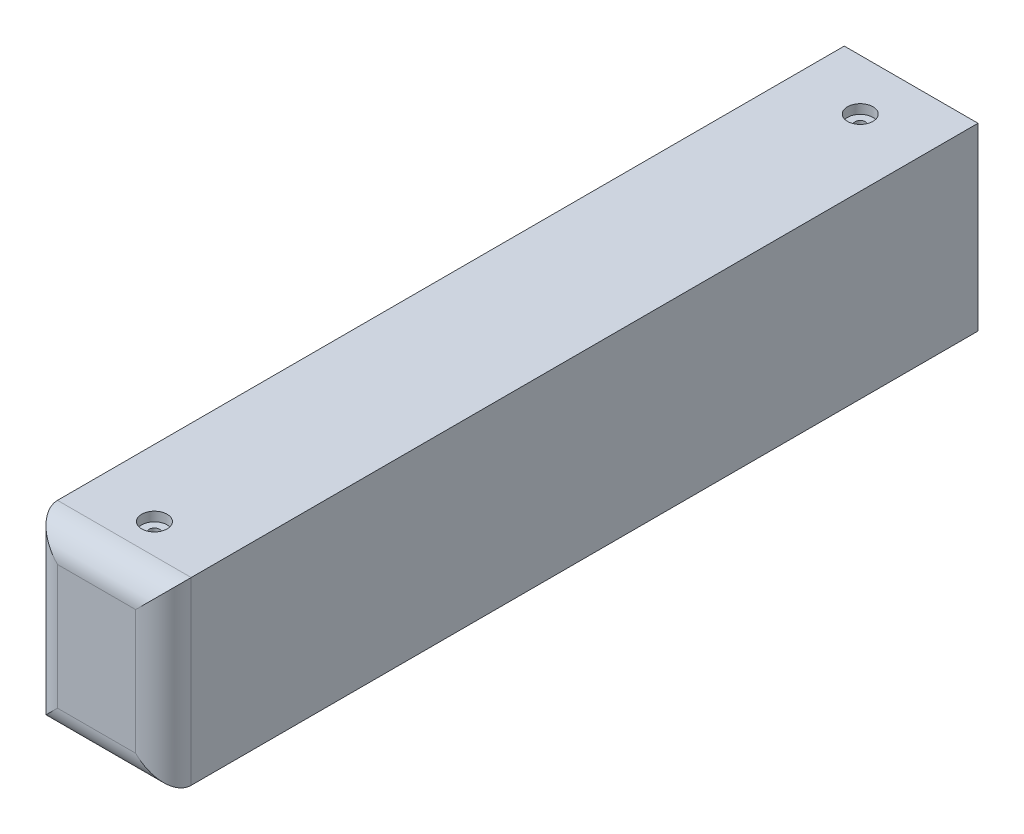
ISO-10303-21;
HEADER;
FILE_DESCRIPTION(('STEP AP214'),'2;1');
FILE_NAME('part.step','',(''),(''),'','','');
FILE_SCHEMA(('AUTOMOTIVE_DESIGN { 1 0 10303 214 1 1 1 1 }'));
ENDSEC;
DATA;
#1=APPLICATION_CONTEXT('core data for automotive mechanical design processes');
#2=APPLICATION_PROTOCOL_DEFINITION('international standard','automotive_design',2000,#1);
#3=PRODUCT_CONTEXT('',#1,'mechanical');
#4=PRODUCT('Part','Part','',(#3));
#5=PRODUCT_RELATED_PRODUCT_CATEGORY('part','',(#4));
#6=PRODUCT_DEFINITION_FORMATION('','',#4);
#7=PRODUCT_DEFINITION_CONTEXT('part definition',#1,'design');
#8=PRODUCT_DEFINITION('design','',#6,#7);
#9=PRODUCT_DEFINITION_SHAPE('','',#8);
#10=(LENGTH_UNIT() NAMED_UNIT(*) SI_UNIT(.MILLI.,.METRE.));
#11=(NAMED_UNIT(*) PLANE_ANGLE_UNIT() SI_UNIT($,.RADIAN.));
#12=(NAMED_UNIT(*) SI_UNIT($,.STERADIAN.) SOLID_ANGLE_UNIT());
#13=UNCERTAINTY_MEASURE_WITH_UNIT(LENGTH_MEASURE(1.E-05),#10,'distance_accuracy_value','');
#14=(GEOMETRIC_REPRESENTATION_CONTEXT(3) GLOBAL_UNCERTAINTY_ASSIGNED_CONTEXT((#13)) GLOBAL_UNIT_ASSIGNED_CONTEXT((#10,
#11,#12)) REPRESENTATION_CONTEXT('',''));
#15=CARTESIAN_POINT('',(0.,0.,0.));
#16=DIRECTION('',(0.,0.,1.));
#17=DIRECTION('',(1.,0.,0.));
#18=AXIS2_PLACEMENT_3D('',#15,#16,#17);
#19=CARTESIAN_POINT('',(57.7777777777778,-77.7777777777778,704.));
#20=DIRECTION('',(0.,1.,0.));
#21=DIRECTION('',(-1.,0.,0.));
#22=AXIS2_PLACEMENT_3D('',#19,#20,#21);
#23=PLANE('',#22);
#24=CARTESIAN_POINT('',(0.,-77.7777777777778,654.));
#25=DIRECTION('',(0.,-1.,0.));
#26=DIRECTION('',(0.,0.,-1.));
#27=AXIS2_PLACEMENT_3D('',#24,#25,#26);
#28=CIRCLE('',#27,7.5);
#29=CARTESIAN_POINT('',(0.,-77.7777777777778,646.5));
#30=VERTEX_POINT('',#29);
#31=EDGE_CURVE('E351',#30,#30,#28,.T.);
#32=ORIENTED_EDGE('',*,*,#31,.F.);
#33=EDGE_LOOP('',(#32));
#34=FACE_BOUND('',#33,.T.);
#35=CARTESIAN_POINT('',(0.,-77.7777777777778,43.9999999999999));
#36=DIRECTION('',(0.,-1.,0.));
#37=DIRECTION('',(0.,0.,-1.));
#38=AXIS2_PLACEMENT_3D('',#35,#36,#37);
#39=CIRCLE('',#38,7.5);
#40=CARTESIAN_POINT('',(0.,-77.7777777777778,36.4999999999999));
#41=VERTEX_POINT('',#40);
#42=EDGE_CURVE('E358',#41,#41,#39,.T.);
#43=ORIENTED_EDGE('',*,*,#42,.F.);
#44=EDGE_LOOP('',(#43));
#45=FACE_BOUND('',#44,.T.);
#46=DIRECTION('',(1.,0.,0.));
#47=VECTOR('',#46,1.);
#48=CARTESIAN_POINT('',(-57.7777777777778,-77.7777777777778,680.));
#49=LINE('',#48,#47);
#50=CARTESIAN_POINT('',(-57.7777777777778,-77.7777777777778,680.));
#51=VERTEX_POINT('',#50);
#52=CARTESIAN_POINT('',(57.7777777777778,-77.7777777777778,680.));
#53=VERTEX_POINT('',#52);
#54=EDGE_CURVE('E98',#51,#53,#49,.T.);
#55=ORIENTED_EDGE('',*,*,#54,.F.);
#56=DIRECTION('',(0.,0.,-1.));
#57=VECTOR('',#56,1.);
#58=CARTESIAN_POINT('',(-57.7777777777778,-77.7777777777778,704.));
#59=LINE('',#58,#57);
#60=CARTESIAN_POINT('',(-57.7777777777778,-77.7777777777778,0.));
#61=VERTEX_POINT('',#60);
#62=EDGE_CURVE('E107',#51,#61,#59,.T.);
#63=ORIENTED_EDGE('',*,*,#62,.T.);
#64=DIRECTION('',(1.,0.,0.));
#65=VECTOR('',#64,1.);
#66=CARTESIAN_POINT('',(57.7777777777778,-77.7777777777778,0.));
#67=LINE('',#66,#65);
#68=CARTESIAN_POINT('',(57.7777777777778,-77.7777777777778,0.));
#69=VERTEX_POINT('',#68);
#70=EDGE_CURVE('E105',#61,#69,#67,.T.);
#71=ORIENTED_EDGE('',*,*,#70,.T.);
#72=DIRECTION('',(0.,0.,-1.));
#73=VECTOR('',#72,1.);
#74=CARTESIAN_POINT('',(57.7777777777778,-77.7777777777778,704.));
#75=LINE('',#74,#73);
#76=EDGE_CURVE('E92',#53,#69,#75,.T.);
#77=ORIENTED_EDGE('',*,*,#76,.F.);
#78=EDGE_LOOP('',(#55,#63,#71,#77));
#79=FACE_BOUND('',#78,.T.);
#80=ADVANCED_FACE('F33',(#34,#45,#79),#23,.F.);
#81=CARTESIAN_POINT('',(0.,0.,704.));
#82=DIRECTION('',(0.,0.,1.));
#83=DIRECTION('',(1.,0.,0.));
#84=AXIS2_PLACEMENT_3D('',#81,#82,#83);
#85=PLANE('',#84);
#86=DIRECTION('',(0.,1.,0.));
#87=VECTOR('',#86,1.);
#88=CARTESIAN_POINT('',(33.7777777777778,-77.7777777777778,704.));
#89=LINE('',#88,#87);
#90=CARTESIAN_POINT('',(33.7777777777778,-53.7777777777778,704.));
#91=VERTEX_POINT('',#90);
#92=CARTESIAN_POINT('',(33.7777777777778,53.7777777777778,704.));
#93=VERTEX_POINT('',#92);
#94=EDGE_CURVE('E47',#91,#93,#89,.T.);
#95=ORIENTED_EDGE('',*,*,#94,.T.);
#96=DIRECTION('',(1.,0.,0.));
#97=VECTOR('',#96,1.);
#98=CARTESIAN_POINT('',(-57.7777777777778,53.7777777777778,704.));
#99=LINE('',#98,#97);
#100=CARTESIAN_POINT('',(-33.7777777777778,53.7777777777778,704.));
#101=VERTEX_POINT('',#100);
#102=EDGE_CURVE('E126',#101,#93,#99,.T.);
#103=ORIENTED_EDGE('',*,*,#102,.F.);
#104=DIRECTION('',(0.,1.,0.));
#105=VECTOR('',#104,1.);
#106=CARTESIAN_POINT('',(-33.7777777777778,-77.7777777777778,704.));
#107=LINE('',#106,#105);
#108=CARTESIAN_POINT('',(-33.7777777777778,-53.7777777777778,704.));
#109=VERTEX_POINT('',#108);
#110=EDGE_CURVE('E102',#109,#101,#107,.T.);
#111=ORIENTED_EDGE('',*,*,#110,.F.);
#112=DIRECTION('',(1.,0.,0.));
#113=VECTOR('',#112,1.);
#114=CARTESIAN_POINT('',(-57.7777777777778,-53.7777777777778,704.));
#115=LINE('',#114,#113);
#116=EDGE_CURVE('E54',#109,#91,#115,.T.);
#117=ORIENTED_EDGE('',*,*,#116,.T.);
#118=EDGE_LOOP('',(#95,#103,#111,#117));
#119=FACE_BOUND('',#118,.T.);
#120=ADVANCED_FACE('F124',(#119),#85,.T.);
#121=CARTESIAN_POINT('',(57.7777777777778,-77.7777777777778,704.));
#122=DIRECTION('',(-1.,0.,0.));
#123=DIRECTION('',(0.,0.,1.));
#124=AXIS2_PLACEMENT_3D('',#121,#122,#123);
#125=PLANE('',#124);
#126=DIRECTION('',(0.,0.,-1.));
#127=VECTOR('',#126,1.);
#128=CARTESIAN_POINT('',(57.7777777777778,77.7777777777778,704.));
#129=LINE('',#128,#127);
#130=CARTESIAN_POINT('',(57.7777777777778,77.7777777777778,680.));
#131=VERTEX_POINT('',#130);
#132=CARTESIAN_POINT('',(57.7777777777778,77.7777777777778,0.));
#133=VERTEX_POINT('',#132);
#134=EDGE_CURVE('E94',#131,#133,#129,.T.);
#135=ORIENTED_EDGE('',*,*,#134,.F.);
#136=DIRECTION('',(0.,1.,0.));
#137=VECTOR('',#136,1.);
#138=CARTESIAN_POINT('',(57.7777777777778,-77.7777777777778,680.));
#139=LINE('',#138,#137);
#140=EDGE_CURVE('E84',#53,#131,#139,.T.);
#141=ORIENTED_EDGE('',*,*,#140,.F.);
#142=ORIENTED_EDGE('',*,*,#76,.T.);
#143=DIRECTION('',(0.,1.,0.));
#144=VECTOR('',#143,1.);
#145=CARTESIAN_POINT('',(57.7777777777778,-77.7777777777778,0.));
#146=LINE('',#145,#144);
#147=EDGE_CURVE('E139',#69,#133,#146,.T.);
#148=ORIENTED_EDGE('',*,*,#147,.T.);
#149=EDGE_LOOP('',(#135,#141,#142,#148));
#150=FACE_BOUND('',#149,.T.);
#151=ADVANCED_FACE('F89',(#150),#125,.F.);
#152=CARTESIAN_POINT('',(-33.7777777777778,-77.7777777777778,680.));
#153=DIRECTION('',(0.,1.,0.));
#154=DIRECTION('',(0.,0.,1.));
#155=AXIS2_PLACEMENT_3D('',#152,#153,#154);
#156=CYLINDRICAL_SURFACE('',#155,24.);
#157=DIRECTION('',(0.,1.,0.));
#158=VECTOR('',#157,1.);
#159=CARTESIAN_POINT('',(-57.7777777777778,-77.7777777777778,680.));
#160=LINE('',#159,#158);
#161=CARTESIAN_POINT('',(-57.7777777777778,77.7777777777778,680.));
#162=VERTEX_POINT('',#161);
#163=EDGE_CURVE('E120',#51,#162,#160,.T.);
#164=ORIENTED_EDGE('',*,*,#163,.F.);
#165=CARTESIAN_POINT('',(-33.7777777777778,-53.7777777777778,680.));
#166=DIRECTION('',(-0.707106781186547,0.707106781186548,0.));
#167=DIRECTION('',(0.707106781186547,0.707106781186548,0.));
#168=AXIS2_PLACEMENT_3D('',#165,#166,#167);
#169=ELLIPSE('',#168,33.9411254969543,24.);
#170=EDGE_CURVE('E41',#51,#109,#169,.T.);
#171=ORIENTED_EDGE('',*,*,#170,.T.);
#172=ORIENTED_EDGE('',*,*,#110,.T.);
#173=CARTESIAN_POINT('',(-33.7777777777778,53.7777777777778,680.));
#174=DIRECTION('',(0.707106781186547,0.707106781186547,0.));
#175=DIRECTION('',(0.707106781186547,-0.707106781186547,0.));
#176=AXIS2_PLACEMENT_3D('',#173,#174,#175);
#177=ELLIPSE('',#176,33.9411254969543,24.);
#178=EDGE_CURVE('E109',#101,#162,#177,.F.);
#179=ORIENTED_EDGE('',*,*,#178,.T.);
#180=EDGE_LOOP('',(#164,#171,#172,#179));
#181=FACE_BOUND('',#180,.T.);
#182=ADVANCED_FACE('F117',(#181),#156,.T.);
#183=CARTESIAN_POINT('',(-57.7777777777778,53.7777777777778,680.));
#184=DIRECTION('',(1.,0.,0.));
#185=DIRECTION('',(0.,0.,-1.));
#186=AXIS2_PLACEMENT_3D('',#183,#184,#185);
#187=CYLINDRICAL_SURFACE('',#186,24.);
#188=ORIENTED_EDGE('',*,*,#102,.T.);
#189=CARTESIAN_POINT('',(33.7777777777778,53.7777777777778,680.));
#190=DIRECTION('',(0.707106781186547,-0.707106781186547,0.));
#191=DIRECTION('',(0.707106781186547,0.707106781186547,0.));
#192=AXIS2_PLACEMENT_3D('',#189,#190,#191);
#193=ELLIPSE('',#192,33.9411254969543,24.);
#194=EDGE_CURVE('E198',#93,#131,#193,.F.);
#195=ORIENTED_EDGE('',*,*,#194,.T.);
#196=DIRECTION('',(1.,0.,0.));
#197=VECTOR('',#196,1.);
#198=CARTESIAN_POINT('',(-57.7777777777778,77.7777777777778,680.));
#199=LINE('',#198,#197);
#200=EDGE_CURVE('E128',#162,#131,#199,.T.);
#201=ORIENTED_EDGE('',*,*,#200,.F.);
#202=ORIENTED_EDGE('',*,*,#178,.F.);
#203=EDGE_LOOP('',(#188,#195,#201,#202));
#204=FACE_BOUND('',#203,.T.);
#205=ADVANCED_FACE('F171',(#204),#187,.T.);
#206=CARTESIAN_POINT('',(57.7777777777778,77.7777777777778,704.));
#207=DIRECTION('',(0.,-1.,0.));
#208=DIRECTION('',(0.,0.,-1.));
#209=AXIS2_PLACEMENT_3D('',#206,#207,#208);
#210=PLANE('',#209);
#211=CARTESIAN_POINT('',(0.,77.7777777777778,654.));
#212=DIRECTION('',(0.,1.,0.));
#213=DIRECTION('',(0.,0.,1.));
#214=AXIS2_PLACEMENT_3D('',#211,#212,#213);
#215=CIRCLE('',#214,11.);
#216=CARTESIAN_POINT('',(0.,77.7777777777778,665.));
#217=VERTEX_POINT('',#216);
#218=EDGE_CURVE('E181',#217,#217,#215,.T.);
#219=ORIENTED_EDGE('',*,*,#218,.F.);
#220=EDGE_LOOP('',(#219));
#221=FACE_BOUND('',#220,.T.);
#222=CARTESIAN_POINT('',(0.,77.7777777777778,43.9999999999999));
#223=DIRECTION('',(0.,1.,0.));
#224=DIRECTION('',(0.,0.,1.));
#225=AXIS2_PLACEMENT_3D('',#222,#223,#224);
#226=CIRCLE('',#225,11.);
#227=CARTESIAN_POINT('',(0.,77.7777777777778,54.9999999999999));
#228=VERTEX_POINT('',#227);
#229=EDGE_CURVE('E184',#228,#228,#226,.T.);
#230=ORIENTED_EDGE('',*,*,#229,.F.);
#231=EDGE_LOOP('',(#230));
#232=FACE_BOUND('',#231,.T.);
#233=ORIENTED_EDGE('',*,*,#200,.T.);
#234=ORIENTED_EDGE('',*,*,#134,.T.);
#235=DIRECTION('',(-1.,0.,0.));
#236=VECTOR('',#235,1.);
#237=CARTESIAN_POINT('',(57.7777777777778,77.7777777777778,0.));
#238=LINE('',#237,#236);
#239=CARTESIAN_POINT('',(-57.7777777777778,77.7777777777778,0.));
#240=VERTEX_POINT('',#239);
#241=EDGE_CURVE('E141',#133,#240,#238,.T.);
#242=ORIENTED_EDGE('',*,*,#241,.T.);
#243=DIRECTION('',(0.,0.,-1.));
#244=VECTOR('',#243,1.);
#245=CARTESIAN_POINT('',(-57.7777777777778,77.7777777777778,704.));
#246=LINE('',#245,#244);
#247=EDGE_CURVE('E111',#162,#240,#246,.T.);
#248=ORIENTED_EDGE('',*,*,#247,.F.);
#249=EDGE_LOOP('',(#233,#234,#242,#248));
#250=FACE_BOUND('',#249,.T.);
#251=ADVANCED_FACE('F149',(#221,#232,#250),#210,.F.);
#252=CARTESIAN_POINT('',(-57.7777777777778,-77.7777777777778,704.));
#253=DIRECTION('',(1.,0.,0.));
#254=DIRECTION('',(0.,0.,-1.));
#255=AXIS2_PLACEMENT_3D('',#252,#253,#254);
#256=PLANE('',#255);
#257=ORIENTED_EDGE('',*,*,#62,.F.);
#258=ORIENTED_EDGE('',*,*,#163,.T.);
#259=ORIENTED_EDGE('',*,*,#247,.T.);
#260=DIRECTION('',(0.,-1.,0.));
#261=VECTOR('',#260,1.);
#262=CARTESIAN_POINT('',(-57.7777777777778,-77.7777777777778,0.));
#263=LINE('',#262,#261);
#264=EDGE_CURVE('E133',#240,#61,#263,.T.);
#265=ORIENTED_EDGE('',*,*,#264,.T.);
#266=EDGE_LOOP('',(#257,#258,#259,#265));
#267=FACE_BOUND('',#266,.T.);
#268=ADVANCED_FACE('F35',(#267),#256,.F.);
#269=CARTESIAN_POINT('',(0.,0.,0.));
#270=DIRECTION('',(0.,0.,1.));
#271=DIRECTION('',(1.,0.,0.));
#272=AXIS2_PLACEMENT_3D('',#269,#270,#271);
#273=PLANE('',#272);
#274=ORIENTED_EDGE('',*,*,#264,.F.);
#275=ORIENTED_EDGE('',*,*,#241,.F.);
#276=ORIENTED_EDGE('',*,*,#147,.F.);
#277=ORIENTED_EDGE('',*,*,#70,.F.);
#278=EDGE_LOOP('',(#274,#275,#276,#277));
#279=FACE_BOUND('',#278,.T.);
#280=ADVANCED_FACE('F151',(#279),#273,.F.);
#281=CARTESIAN_POINT('',(-57.7777777777778,-53.7777777777778,680.));
#282=DIRECTION('',(1.,0.,0.));
#283=DIRECTION('',(0.,0.,-1.));
#284=AXIS2_PLACEMENT_3D('',#281,#282,#283);
#285=CYLINDRICAL_SURFACE('',#284,24.);
#286=CARTESIAN_POINT('',(33.7777777777778,-53.7777777777778,680.));
#287=DIRECTION('',(0.707106781186547,0.707106781186548,0.));
#288=DIRECTION('',(0.707106781186547,-0.707106781186548,0.));
#289=AXIS2_PLACEMENT_3D('',#286,#287,#288);
#290=ELLIPSE('',#289,33.9411254969543,24.);
#291=EDGE_CURVE('E11',#91,#53,#290,.T.);
#292=ORIENTED_EDGE('',*,*,#291,.F.);
#293=ORIENTED_EDGE('',*,*,#116,.F.);
#294=ORIENTED_EDGE('',*,*,#170,.F.);
#295=ORIENTED_EDGE('',*,*,#54,.T.);
#296=EDGE_LOOP('',(#292,#293,#294,#295));
#297=FACE_BOUND('',#296,.T.);
#298=ADVANCED_FACE('F99',(#297),#285,.T.);
#299=CARTESIAN_POINT('',(33.7777777777778,-77.7777777777778,680.));
#300=DIRECTION('',(0.,1.,0.));
#301=DIRECTION('',(0.,0.,1.));
#302=AXIS2_PLACEMENT_3D('',#299,#300,#301);
#303=CYLINDRICAL_SURFACE('',#302,24.);
#304=ORIENTED_EDGE('',*,*,#94,.F.);
#305=ORIENTED_EDGE('',*,*,#291,.T.);
#306=ORIENTED_EDGE('',*,*,#140,.T.);
#307=ORIENTED_EDGE('',*,*,#194,.F.);
#308=EDGE_LOOP('',(#304,#305,#306,#307));
#309=FACE_BOUND('',#308,.T.);
#310=ADVANCED_FACE('F83',(#309),#303,.T.);
#311=CARTESIAN_POINT('',(0.,77.7777777777778,43.9999999999999));
#312=DIRECTION('',(0.,1.,0.));
#313=DIRECTION('',(0.,0.,1.));
#314=AXIS2_PLACEMENT_3D('',#311,#312,#313);
#315=CYLINDRICAL_SURFACE('',#314,4.49999999999999);
#316=CARTESIAN_POINT('',(0.,-69.7777777777778,43.9999999999999));
#317=DIRECTION('',(0.,-1.,0.));
#318=DIRECTION('',(0.,0.,-1.));
#319=AXIS2_PLACEMENT_3D('',#316,#317,#318);
#320=CIRCLE('',#319,4.50000000000001);
#321=CARTESIAN_POINT('',(0.,-69.7777777777778,39.4999999999999));
#322=VERTEX_POINT('',#321);
#323=EDGE_CURVE('E364',#322,#322,#320,.T.);
#324=ORIENTED_EDGE('',*,*,#323,.T.);
#325=EDGE_LOOP('',(#324));
#326=FACE_BOUND('',#325,.T.);
#327=CARTESIAN_POINT('',(0.,69.7777777777778,43.9999999999999));
#328=DIRECTION('',(0.,1.,0.));
#329=DIRECTION('',(0.,0.,1.));
#330=AXIS2_PLACEMENT_3D('',#327,#328,#329);
#331=CIRCLE('',#330,4.50000000000002);
#332=CARTESIAN_POINT('',(0.,69.7777777777778,48.4999999999999));
#333=VERTEX_POINT('',#332);
#334=EDGE_CURVE('E95',#333,#333,#331,.T.);
#335=ORIENTED_EDGE('',*,*,#334,.T.);
#336=EDGE_LOOP('',(#335));
#337=FACE_BOUND('',#336,.T.);
#338=ADVANCED_FACE('F202',(#326,#337),#315,.F.);
#339=CARTESIAN_POINT('',(4.50000000000002,69.7777777777778,43.9999999999999));
#340=DIRECTION('',(0.,-1.,0.));
#341=DIRECTION('',(0.,0.,-1.));
#342=AXIS2_PLACEMENT_3D('',#339,#340,#341);
#343=PLANE('',#342);
#344=ORIENTED_EDGE('',*,*,#334,.F.);
#345=EDGE_LOOP('',(#344));
#346=FACE_BOUND('',#345,.T.);
#347=CARTESIAN_POINT('',(0.,69.7777777777778,43.9999999999999));
#348=DIRECTION('',(0.,1.,0.));
#349=DIRECTION('',(0.,0.,1.));
#350=AXIS2_PLACEMENT_3D('',#347,#348,#349);
#351=CIRCLE('',#350,11.);
#352=CARTESIAN_POINT('',(0.,69.7777777777778,54.9999999999999));
#353=VERTEX_POINT('',#352);
#354=EDGE_CURVE('E186',#353,#353,#351,.T.);
#355=ORIENTED_EDGE('',*,*,#354,.T.);
#356=EDGE_LOOP('',(#355));
#357=FACE_BOUND('',#356,.T.);
#358=ADVANCED_FACE('F204',(#346,#357),#343,.F.);
#359=CARTESIAN_POINT('',(0.,77.7777777777778,43.9999999999999));
#360=DIRECTION('',(0.,1.,0.));
#361=DIRECTION('',(0.,0.,1.));
#362=AXIS2_PLACEMENT_3D('',#359,#360,#361);
#363=CYLINDRICAL_SURFACE('',#362,11.);
#364=ORIENTED_EDGE('',*,*,#354,.F.);
#365=EDGE_LOOP('',(#364));
#366=FACE_BOUND('',#365,.T.);
#367=ORIENTED_EDGE('',*,*,#229,.T.);
#368=EDGE_LOOP('',(#367));
#369=FACE_BOUND('',#368,.T.);
#370=ADVANCED_FACE('F207',(#366,#369),#363,.F.);
#371=CARTESIAN_POINT('',(0.,77.7777777777778,654.));
#372=DIRECTION('',(0.,1.,0.));
#373=DIRECTION('',(0.,0.,1.));
#374=AXIS2_PLACEMENT_3D('',#371,#372,#373);
#375=CYLINDRICAL_SURFACE('',#374,4.49999999999999);
#376=CARTESIAN_POINT('',(0.,-69.7777777777778,654.));
#377=DIRECTION('',(0.,-1.,0.));
#378=DIRECTION('',(0.,0.,-1.));
#379=AXIS2_PLACEMENT_3D('',#376,#377,#378);
#380=CIRCLE('',#379,4.50000000000001);
#381=CARTESIAN_POINT('',(0.,-69.7777777777778,649.5));
#382=VERTEX_POINT('',#381);
#383=EDGE_CURVE('E353',#382,#382,#380,.T.);
#384=ORIENTED_EDGE('',*,*,#383,.T.);
#385=EDGE_LOOP('',(#384));
#386=FACE_BOUND('',#385,.T.);
#387=CARTESIAN_POINT('',(0.,69.7777777777778,654.));
#388=DIRECTION('',(0.,1.,0.));
#389=DIRECTION('',(0.,0.,1.));
#390=AXIS2_PLACEMENT_3D('',#387,#388,#389);
#391=CIRCLE('',#390,4.50000000000002);
#392=CARTESIAN_POINT('',(0.,69.7777777777778,658.5));
#393=VERTEX_POINT('',#392);
#394=EDGE_CURVE('E187',#393,#393,#391,.T.);
#395=ORIENTED_EDGE('',*,*,#394,.T.);
#396=EDGE_LOOP('',(#395));
#397=FACE_BOUND('',#396,.T.);
#398=ADVANCED_FACE('F212',(#386,#397),#375,.F.);
#399=CARTESIAN_POINT('',(4.50000000000002,69.7777777777778,654.));
#400=DIRECTION('',(0.,-1.,0.));
#401=DIRECTION('',(0.,0.,-1.));
#402=AXIS2_PLACEMENT_3D('',#399,#400,#401);
#403=PLANE('',#402);
#404=ORIENTED_EDGE('',*,*,#394,.F.);
#405=EDGE_LOOP('',(#404));
#406=FACE_BOUND('',#405,.T.);
#407=CARTESIAN_POINT('',(0.,69.7777777777778,654.));
#408=DIRECTION('',(0.,1.,0.));
#409=DIRECTION('',(0.,0.,1.));
#410=AXIS2_PLACEMENT_3D('',#407,#408,#409);
#411=CIRCLE('',#410,11.);
#412=CARTESIAN_POINT('',(0.,69.7777777777778,665.));
#413=VERTEX_POINT('',#412);
#414=EDGE_CURVE('E192',#413,#413,#411,.T.);
#415=ORIENTED_EDGE('',*,*,#414,.T.);
#416=EDGE_LOOP('',(#415));
#417=FACE_BOUND('',#416,.T.);
#418=ADVANCED_FACE('F217',(#406,#417),#403,.F.);
#419=CARTESIAN_POINT('',(0.,77.7777777777778,654.));
#420=DIRECTION('',(0.,1.,0.));
#421=DIRECTION('',(0.,0.,1.));
#422=AXIS2_PLACEMENT_3D('',#419,#420,#421);
#423=CYLINDRICAL_SURFACE('',#422,11.);
#424=ORIENTED_EDGE('',*,*,#414,.F.);
#425=EDGE_LOOP('',(#424));
#426=FACE_BOUND('',#425,.T.);
#427=ORIENTED_EDGE('',*,*,#218,.T.);
#428=EDGE_LOOP('',(#427));
#429=FACE_BOUND('',#428,.T.);
#430=ADVANCED_FACE('F279',(#426,#429),#423,.F.);
#431=CARTESIAN_POINT('',(4.50000000000001,-69.7777777777778,43.9999999999999));
#432=DIRECTION('',(0.,1.,0.));
#433=DIRECTION('',(0.,0.,1.));
#434=AXIS2_PLACEMENT_3D('',#431,#432,#433);
#435=PLANE('',#434);
#436=ORIENTED_EDGE('',*,*,#323,.F.);
#437=EDGE_LOOP('',(#436));
#438=FACE_BOUND('',#437,.T.);
#439=CARTESIAN_POINT('',(0.,-69.7777777777778,43.9999999999999));
#440=DIRECTION('',(0.,-1.,0.));
#441=DIRECTION('',(0.,0.,-1.));
#442=AXIS2_PLACEMENT_3D('',#439,#440,#441);
#443=CIRCLE('',#442,7.5);
#444=CARTESIAN_POINT('',(0.,-69.7777777777778,36.4999999999999));
#445=VERTEX_POINT('',#444);
#446=EDGE_CURVE('E361',#445,#445,#443,.T.);
#447=ORIENTED_EDGE('',*,*,#446,.T.);
#448=EDGE_LOOP('',(#447));
#449=FACE_BOUND('',#448,.T.);
#450=ADVANCED_FACE('F287',(#438,#449),#435,.F.);
#451=CARTESIAN_POINT('',(0.,-77.7777777777778,43.9999999999999));
#452=DIRECTION('',(0.,-1.,0.));
#453=DIRECTION('',(0.,0.,-1.));
#454=AXIS2_PLACEMENT_3D('',#451,#452,#453);
#455=CYLINDRICAL_SURFACE('',#454,7.5);
#456=ORIENTED_EDGE('',*,*,#446,.F.);
#457=EDGE_LOOP('',(#456));
#458=FACE_BOUND('',#457,.T.);
#459=ORIENTED_EDGE('',*,*,#42,.T.);
#460=EDGE_LOOP('',(#459));
#461=FACE_BOUND('',#460,.T.);
#462=ADVANCED_FACE('F312',(#458,#461),#455,.F.);
#463=CARTESIAN_POINT('',(4.50000000000001,-69.7777777777778,654.));
#464=DIRECTION('',(0.,1.,0.));
#465=DIRECTION('',(0.,0.,1.));
#466=AXIS2_PLACEMENT_3D('',#463,#464,#465);
#467=PLANE('',#466);
#468=ORIENTED_EDGE('',*,*,#383,.F.);
#469=EDGE_LOOP('',(#468));
#470=FACE_BOUND('',#469,.T.);
#471=CARTESIAN_POINT('',(0.,-69.7777777777778,654.));
#472=DIRECTION('',(0.,-1.,0.));
#473=DIRECTION('',(0.,0.,-1.));
#474=AXIS2_PLACEMENT_3D('',#471,#472,#473);
#475=CIRCLE('',#474,7.5);
#476=CARTESIAN_POINT('',(0.,-69.7777777777778,646.5));
#477=VERTEX_POINT('',#476);
#478=EDGE_CURVE('E349',#477,#477,#475,.T.);
#479=ORIENTED_EDGE('',*,*,#478,.T.);
#480=EDGE_LOOP('',(#479));
#481=FACE_BOUND('',#480,.T.);
#482=ADVANCED_FACE('F322',(#470,#481),#467,.F.);
#483=CARTESIAN_POINT('',(0.,-77.7777777777778,654.));
#484=DIRECTION('',(0.,-1.,0.));
#485=DIRECTION('',(0.,0.,-1.));
#486=AXIS2_PLACEMENT_3D('',#483,#484,#485);
#487=CYLINDRICAL_SURFACE('',#486,7.5);
#488=ORIENTED_EDGE('',*,*,#478,.F.);
#489=EDGE_LOOP('',(#488));
#490=FACE_BOUND('',#489,.T.);
#491=ORIENTED_EDGE('',*,*,#31,.T.);
#492=EDGE_LOOP('',(#491));
#493=FACE_BOUND('',#492,.T.);
#494=ADVANCED_FACE('F332',(#490,#493),#487,.F.);
#495=CLOSED_SHELL('',(#80,#120,#151,#182,#205,#251,#268,#280,#298,#310,#338,#358,#370,#398,#418,
#430,#450,#462,#482,#494));
#496=MANIFOLD_SOLID_BREP('B2',#495);
#497=ADVANCED_BREP_SHAPE_REPRESENTATION('',(#18,#496),#14);
#498=SHAPE_DEFINITION_REPRESENTATION(#9,#497);
ENDSEC;
END-ISO-10303-21;
